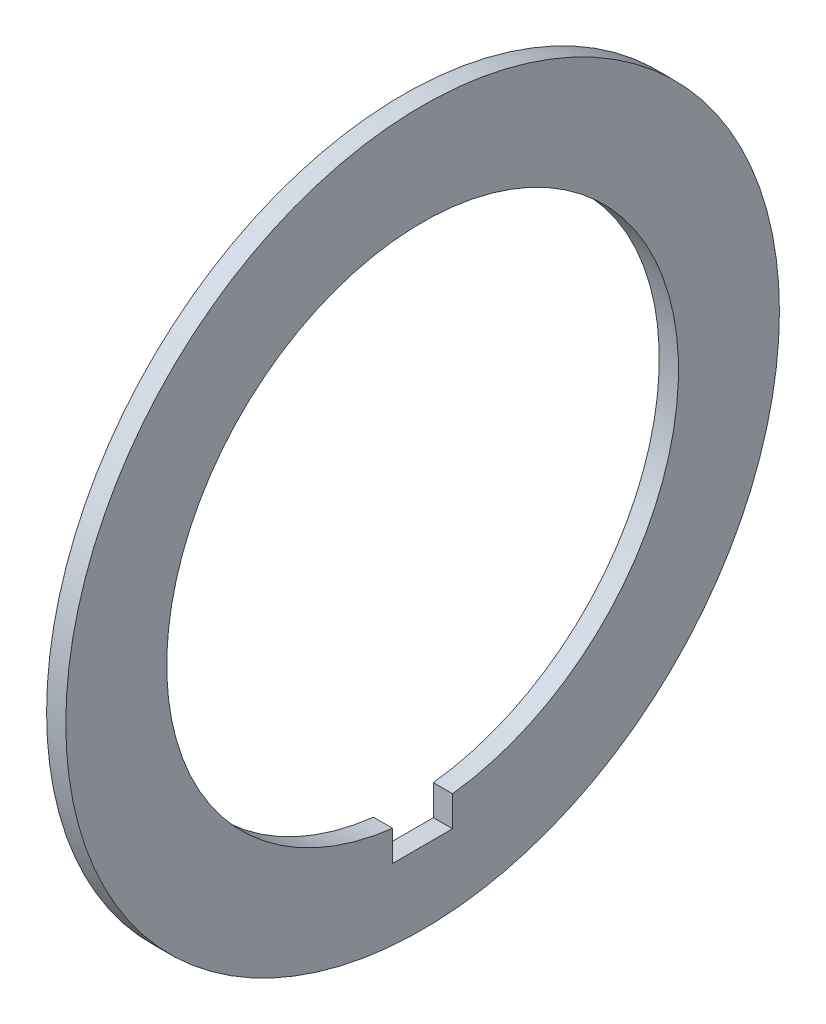
ISO-10303-21;
HEADER;
FILE_DESCRIPTION(('STEP AP214'),'2;1');
FILE_NAME('part.step','',(''),(''),'','','');
FILE_SCHEMA(('AUTOMOTIVE_DESIGN { 1 0 10303 214 1 1 1 1 }'));
ENDSEC;
DATA;
#1=APPLICATION_CONTEXT('core data for automotive mechanical design processes');
#2=APPLICATION_PROTOCOL_DEFINITION('international standard','automotive_design',2000,#1);
#3=PRODUCT_CONTEXT('',#1,'mechanical');
#4=PRODUCT('Part','Part','',(#3));
#5=PRODUCT_RELATED_PRODUCT_CATEGORY('part','',(#4));
#6=PRODUCT_DEFINITION_FORMATION('','',#4);
#7=PRODUCT_DEFINITION_CONTEXT('part definition',#1,'design');
#8=PRODUCT_DEFINITION('design','',#6,#7);
#9=PRODUCT_DEFINITION_SHAPE('','',#8);
#10=(LENGTH_UNIT() NAMED_UNIT(*) SI_UNIT(.MILLI.,.METRE.));
#11=(NAMED_UNIT(*) PLANE_ANGLE_UNIT() SI_UNIT($,.RADIAN.));
#12=(NAMED_UNIT(*) SI_UNIT($,.STERADIAN.) SOLID_ANGLE_UNIT());
#13=UNCERTAINTY_MEASURE_WITH_UNIT(LENGTH_MEASURE(1.E-05),#10,'distance_accuracy_value','');
#14=(GEOMETRIC_REPRESENTATION_CONTEXT(3) GLOBAL_UNCERTAINTY_ASSIGNED_CONTEXT((#13)) GLOBAL_UNIT_ASSIGNED_CONTEXT((#10,
#11,#12)) REPRESENTATION_CONTEXT('',''));
#15=CARTESIAN_POINT('',(0.,0.,0.));
#16=DIRECTION('',(0.,0.,1.));
#17=DIRECTION('',(1.,0.,0.));
#18=AXIS2_PLACEMENT_3D('',#15,#16,#17);
#19=CARTESIAN_POINT('',(8.45,19.71659157584,0.));
#20=DIRECTION('',(1.,0.,0.));
#21=DIRECTION('',(0.,0.,-1.));
#22=AXIS2_PLACEMENT_3D('',#19,#20,#21);
#23=PLANE('',#22);
#24=DIRECTION('',(0.,1.,0.));
#25=VECTOR('',#24,1.);
#26=CARTESIAN_POINT('',(8.45,-14.30333312752,-1.59));
#27=LINE('',#26,#25);
#28=CARTESIAN_POINT('',(8.45,-13.4966662550412,-1.59));
#29=VERTEX_POINT('',#28);
#30=CARTESIAN_POINT('',(8.45,-15.11,-1.59));
#31=VERTEX_POINT('',#30);
#32=EDGE_CURVE('E57',#29,#31,#27,.F.);
#33=ORIENTED_EDGE('',*,*,#32,.T.);
#34=DIRECTION('',(0.,0.,-1.));
#35=VECTOR('',#34,1.);
#36=CARTESIAN_POINT('',(8.45,-15.11,0.));
#37=LINE('',#36,#35);
#38=CARTESIAN_POINT('',(8.45,-15.11,1.59));
#39=VERTEX_POINT('',#38);
#40=EDGE_CURVE('E80',#31,#39,#37,.F.);
#41=ORIENTED_EDGE('',*,*,#40,.T.);
#42=DIRECTION('',(0.,1.,0.));
#43=VECTOR('',#42,1.);
#44=CARTESIAN_POINT('',(8.45,19.71659157584,1.59));
#45=LINE('',#44,#43);
#46=CARTESIAN_POINT('',(8.45,-13.4966662550412,1.59));
#47=VERTEX_POINT('',#46);
#48=EDGE_CURVE('E59',#39,#47,#45,.T.);
#49=ORIENTED_EDGE('',*,*,#48,.T.);
#50=CARTESIAN_POINT('',(8.45,0.,0.));
#51=DIRECTION('',(-1.,0.,0.));
#52=DIRECTION('',(0.,0.,1.));
#53=AXIS2_PLACEMENT_3D('',#50,#51,#52);
#54=CIRCLE('',#53,13.59);
#55=EDGE_CURVE('E53',#47,#29,#54,.T.);
#56=ORIENTED_EDGE('',*,*,#55,.T.);
#57=EDGE_LOOP('',(#33,#41,#49,#56));
#58=FACE_BOUND('',#57,.T.);
#59=CARTESIAN_POINT('',(8.45,0.,0.));
#60=DIRECTION('',(-1.,0.,0.));
#61=DIRECTION('',(0.,0.,1.));
#62=AXIS2_PLACEMENT_3D('',#59,#60,#61);
#63=CIRCLE('',#62,18.95);
#64=CARTESIAN_POINT('',(8.45,0.,18.95));
#65=VERTEX_POINT('',#64);
#66=EDGE_CURVE('E19',#65,#65,#63,.T.);
#67=ORIENTED_EDGE('',*,*,#66,.F.);
#68=EDGE_LOOP('',(#67));
#69=FACE_BOUND('',#68,.T.);
#70=ADVANCED_FACE('F16',(#58,#69),#23,.T.);
#71=CARTESIAN_POINT('',(7.94,0.,0.));
#72=DIRECTION('',(-1.,0.,0.));
#73=DIRECTION('',(0.,0.,1.));
#74=AXIS2_PLACEMENT_3D('',#71,#72,#73);
#75=CYLINDRICAL_SURFACE('',#74,18.95);
#76=CARTESIAN_POINT('',(7.43,0.,0.));
#77=DIRECTION('',(-1.,0.,0.));
#78=DIRECTION('',(0.,0.,1.));
#79=AXIS2_PLACEMENT_3D('',#76,#77,#78);
#80=CIRCLE('',#79,18.95);
#81=CARTESIAN_POINT('',(7.43,0.,18.95));
#82=VERTEX_POINT('',#81);
#83=EDGE_CURVE('E91',#82,#82,#80,.F.);
#84=ORIENTED_EDGE('',*,*,#83,.T.);
#85=EDGE_LOOP('',(#84));
#86=FACE_BOUND('',#85,.T.);
#87=ORIENTED_EDGE('',*,*,#66,.T.);
#88=EDGE_LOOP('',(#87));
#89=FACE_BOUND('',#88,.T.);
#90=ADVANCED_FACE('F157',(#86,#89),#75,.T.);
#91=CARTESIAN_POINT('',(7.94,0.,0.));
#92=DIRECTION('',(-1.,0.,0.));
#93=DIRECTION('',(0.,0.,1.));
#94=AXIS2_PLACEMENT_3D('',#91,#92,#93);
#95=CYLINDRICAL_SURFACE('',#94,13.59);
#96=CARTESIAN_POINT('',(7.43,0.,0.));
#97=DIRECTION('',(-1.,0.,0.));
#98=DIRECTION('',(0.,0.,1.));
#99=AXIS2_PLACEMENT_3D('',#96,#97,#98);
#100=CIRCLE('',#99,13.59);
#101=CARTESIAN_POINT('',(7.43,-13.4966662550412,1.59));
#102=VERTEX_POINT('',#101);
#103=CARTESIAN_POINT('',(7.43,-13.4966662550412,-1.59));
#104=VERTEX_POINT('',#103);
#105=EDGE_CURVE('E74',#102,#104,#100,.T.);
#106=ORIENTED_EDGE('',*,*,#105,.T.);
#107=DIRECTION('',(-1.,0.,0.));
#108=VECTOR('',#107,1.);
#109=CARTESIAN_POINT('',(7.4096,-13.49666625504,-1.59));
#110=LINE('',#109,#108);
#111=EDGE_CURVE('E64',#104,#29,#110,.F.);
#112=ORIENTED_EDGE('',*,*,#111,.T.);
#113=ORIENTED_EDGE('',*,*,#55,.F.);
#114=DIRECTION('',(1.,0.,0.));
#115=VECTOR('',#114,1.);
#116=CARTESIAN_POINT('',(7.4096,-13.49666625504,1.59));
#117=LINE('',#116,#115);
#118=EDGE_CURVE('E93',#47,#102,#117,.F.);
#119=ORIENTED_EDGE('',*,*,#118,.T.);
#120=EDGE_LOOP('',(#106,#112,#113,#119));
#121=FACE_BOUND('',#120,.T.);
#122=ADVANCED_FACE('F73',(#121),#95,.F.);
#123=CARTESIAN_POINT('',(7.4096,-14.30333312752,-1.59));
#124=DIRECTION('',(0.,0.,-1.));
#125=DIRECTION('',(-1.,0.,0.));
#126=AXIS2_PLACEMENT_3D('',#123,#124,#125);
#127=PLANE('',#126);
#128=DIRECTION('',(1.,0.,0.));
#129=VECTOR('',#128,1.);
#130=CARTESIAN_POINT('',(7.4096,-15.11,-1.59));
#131=LINE('',#130,#129);
#132=CARTESIAN_POINT('',(7.43,-15.11,-1.59));
#133=VERTEX_POINT('',#132);
#134=EDGE_CURVE('E71',#133,#31,#131,.T.);
#135=ORIENTED_EDGE('',*,*,#134,.T.);
#136=ORIENTED_EDGE('',*,*,#32,.F.);
#137=ORIENTED_EDGE('',*,*,#111,.F.);
#138=DIRECTION('',(0.,1.,0.));
#139=VECTOR('',#138,1.);
#140=CARTESIAN_POINT('',(7.43,19.71659157584,-1.59));
#141=LINE('',#140,#139);
#142=EDGE_CURVE('E90',#104,#133,#141,.F.);
#143=ORIENTED_EDGE('',*,*,#142,.T.);
#144=EDGE_LOOP('',(#135,#136,#137,#143));
#145=FACE_BOUND('',#144,.T.);
#146=ADVANCED_FACE('F68',(#145),#127,.F.);
#147=CARTESIAN_POINT('',(7.4096,-15.11,0.));
#148=DIRECTION('',(0.,-1.,0.));
#149=DIRECTION('',(0.,0.,-1.));
#150=AXIS2_PLACEMENT_3D('',#147,#148,#149);
#151=PLANE('',#150);
#152=DIRECTION('',(1.,0.,0.));
#153=VECTOR('',#152,1.);
#154=CARTESIAN_POINT('',(7.4096,-15.11,1.59));
#155=LINE('',#154,#153);
#156=CARTESIAN_POINT('',(7.43,-15.11,1.59));
#157=VERTEX_POINT('',#156);
#158=EDGE_CURVE('E33',#157,#39,#155,.T.);
#159=ORIENTED_EDGE('',*,*,#158,.T.);
#160=ORIENTED_EDGE('',*,*,#40,.F.);
#161=ORIENTED_EDGE('',*,*,#134,.F.);
#162=DIRECTION('',(0.,0.,-1.));
#163=VECTOR('',#162,1.);
#164=CARTESIAN_POINT('',(7.43,-15.11,0.));
#165=LINE('',#164,#163);
#166=EDGE_CURVE('E25',#133,#157,#165,.F.);
#167=ORIENTED_EDGE('',*,*,#166,.T.);
#168=EDGE_LOOP('',(#159,#160,#161,#167));
#169=FACE_BOUND('',#168,.T.);
#170=ADVANCED_FACE('F115',(#169),#151,.F.);
#171=CARTESIAN_POINT('',(7.4096,-14.30333312752,1.59));
#172=DIRECTION('',(0.,0.,1.));
#173=DIRECTION('',(1.,0.,0.));
#174=AXIS2_PLACEMENT_3D('',#171,#172,#173);
#175=PLANE('',#174);
#176=ORIENTED_EDGE('',*,*,#118,.F.);
#177=ORIENTED_EDGE('',*,*,#48,.F.);
#178=ORIENTED_EDGE('',*,*,#158,.F.);
#179=DIRECTION('',(0.,1.,0.));
#180=VECTOR('',#179,1.);
#181=CARTESIAN_POINT('',(7.43,19.71659157584,1.59));
#182=LINE('',#181,#180);
#183=EDGE_CURVE('E10',#157,#102,#182,.T.);
#184=ORIENTED_EDGE('',*,*,#183,.T.);
#185=EDGE_LOOP('',(#176,#177,#178,#184));
#186=FACE_BOUND('',#185,.T.);
#187=ADVANCED_FACE('F114',(#186),#175,.F.);
#188=CARTESIAN_POINT('',(7.43,19.71659157584,0.));
#189=DIRECTION('',(1.,0.,0.));
#190=DIRECTION('',(0.,0.,-1.));
#191=AXIS2_PLACEMENT_3D('',#188,#189,#190);
#192=PLANE('',#191);
#193=ORIENTED_EDGE('',*,*,#166,.F.);
#194=ORIENTED_EDGE('',*,*,#142,.F.);
#195=ORIENTED_EDGE('',*,*,#105,.F.);
#196=ORIENTED_EDGE('',*,*,#183,.F.);
#197=EDGE_LOOP('',(#193,#194,#195,#196));
#198=FACE_BOUND('',#197,.T.);
#199=ORIENTED_EDGE('',*,*,#83,.F.);
#200=EDGE_LOOP('',(#199));
#201=FACE_BOUND('',#200,.T.);
#202=ADVANCED_FACE('F112',(#198,#201),#192,.F.);
#203=CLOSED_SHELL('',(#70,#90,#122,#146,#170,#187,#202));
#204=MANIFOLD_SOLID_BREP('B1',#203);
#205=ADVANCED_BREP_SHAPE_REPRESENTATION('',(#18,#204),#14);
#206=SHAPE_DEFINITION_REPRESENTATION(#9,#205);
ENDSEC;
END-ISO-10303-21;
